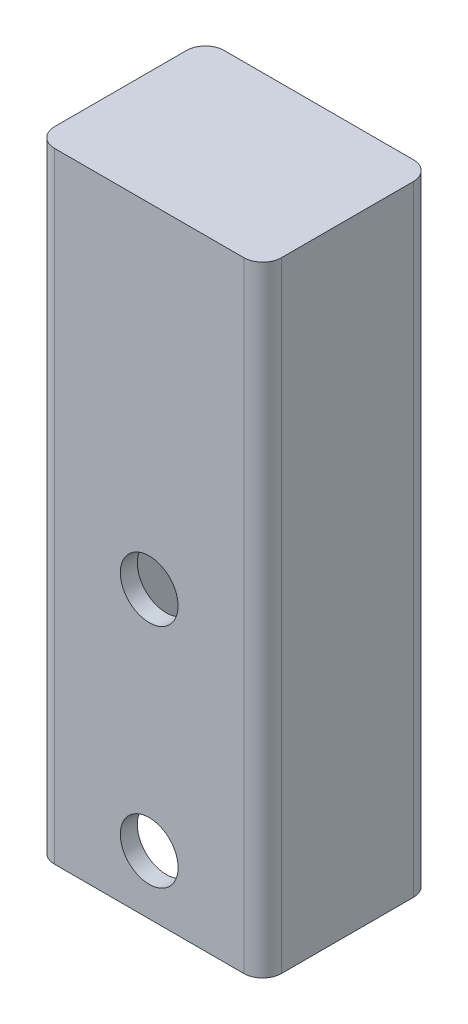
ISO-10303-21;
HEADER;
FILE_DESCRIPTION(('STEP AP214'),'2;1');
FILE_NAME('part.step','',(''),(''),'','','');
FILE_SCHEMA(('AUTOMOTIVE_DESIGN { 1 0 10303 214 1 1 1 1 }'));
ENDSEC;
DATA;
#1=APPLICATION_CONTEXT('core data for automotive mechanical design processes');
#2=APPLICATION_PROTOCOL_DEFINITION('international standard','automotive_design',2000,#1);
#3=PRODUCT_CONTEXT('',#1,'mechanical');
#4=PRODUCT('Part','Part','',(#3));
#5=PRODUCT_RELATED_PRODUCT_CATEGORY('part','',(#4));
#6=PRODUCT_DEFINITION_FORMATION('','',#4);
#7=PRODUCT_DEFINITION_CONTEXT('part definition',#1,'design');
#8=PRODUCT_DEFINITION('design','',#6,#7);
#9=PRODUCT_DEFINITION_SHAPE('','',#8);
#10=(LENGTH_UNIT() NAMED_UNIT(*) SI_UNIT(.MILLI.,.METRE.));
#11=(NAMED_UNIT(*) PLANE_ANGLE_UNIT() SI_UNIT($,.RADIAN.));
#12=(NAMED_UNIT(*) SI_UNIT($,.STERADIAN.) SOLID_ANGLE_UNIT());
#13=UNCERTAINTY_MEASURE_WITH_UNIT(LENGTH_MEASURE(1.E-05),#10,'distance_accuracy_value','');
#14=(GEOMETRIC_REPRESENTATION_CONTEXT(3) GLOBAL_UNCERTAINTY_ASSIGNED_CONTEXT((#13)) GLOBAL_UNIT_ASSIGNED_CONTEXT((#10,
#11,#12)) REPRESENTATION_CONTEXT('',''));
#15=CARTESIAN_POINT('',(0.,0.,0.));
#16=DIRECTION('',(0.,0.,1.));
#17=DIRECTION('',(1.,0.,0.));
#18=AXIS2_PLACEMENT_3D('',#15,#16,#17);
#19=CARTESIAN_POINT('',(16.6979999999778,-85.0268872608011,11.6380000000366));
#20=DIRECTION('',(0.,1.,0.));
#21=DIRECTION('',(-1.,0.,0.));
#22=AXIS2_PLACEMENT_3D('',#19,#20,#21);
#23=CYLINDRICAL_SURFACE('',#22,3.32639999999996);
#24=DIRECTION('',(0.,1.,0.));
#25=VECTOR('',#24,1.);
#26=CARTESIAN_POINT('',(20.0243999999777,-85.0268872608011,11.6380000000366));
#27=LINE('',#26,#25);
#28=CARTESIAN_POINT('',(20.0243999999777,-85.0268872608011,11.6380000000366));
#29=VERTEX_POINT('',#28);
#30=CARTESIAN_POINT('',(20.0243999999767,24.3811127391959,11.6380000000366));
#31=VERTEX_POINT('',#30);
#32=EDGE_CURVE('E264',#29,#31,#27,.T.);
#33=ORIENTED_EDGE('',*,*,#32,.T.);
#34=CARTESIAN_POINT('',(16.6979999999768,24.381112739196,11.6380000000366));
#35=DIRECTION('',(0.,1.,2.47524059519471E-13));
#36=DIRECTION('',(0.,-2.47524059519471E-13,1.));
#37=AXIS2_PLACEMENT_3D('',#34,#35,#36);
#38=CIRCLE('',#37,3.32639999999996);
#39=CARTESIAN_POINT('',(16.6979999999772,24.3811127391951,14.9644000000365));
#40=VERTEX_POINT('',#39);
#41=EDGE_CURVE('E215',#31,#40,#38,.F.);
#42=ORIENTED_EDGE('',*,*,#41,.T.);
#43=DIRECTION('',(0.,1.,0.));
#44=VECTOR('',#43,1.);
#45=CARTESIAN_POINT('',(16.6979999999778,-85.0268872608011,14.9644000000365));
#46=LINE('',#45,#44);
#47=CARTESIAN_POINT('',(16.6979999999778,-85.0268872608011,14.9644000000365));
#48=VERTEX_POINT('',#47);
#49=EDGE_CURVE('E11',#48,#40,#46,.T.);
#50=ORIENTED_EDGE('',*,*,#49,.F.);
#51=CARTESIAN_POINT('',(16.6979999999778,-85.0268872608011,11.6380000000366));
#52=DIRECTION('',(0.,-1.,0.));
#53=DIRECTION('',(1.,0.,0.));
#54=AXIS2_PLACEMENT_3D('',#51,#52,#53);
#55=CIRCLE('',#54,3.32639999999996);
#56=EDGE_CURVE('E218',#29,#48,#55,.T.);
#57=ORIENTED_EDGE('',*,*,#56,.F.);
#58=EDGE_LOOP('',(#33,#42,#50,#57));
#59=FACE_BOUND('',#58,.T.);
#60=ADVANCED_FACE('F38',(#59),#23,.T.);
#61=CARTESIAN_POINT('',(16.6979999999778,-85.0268872608011,14.9644000000365));
#62=DIRECTION('',(0.,0.,-1.));
#63=DIRECTION('',(-1.,0.,0.));
#64=AXIS2_PLACEMENT_3D('',#61,#62,#63);
#65=PLANE('',#64);
#66=CARTESIAN_POINT('',(0.,-34.6469992698592,14.9644000000366));
#67=DIRECTION('',(0.,0.,1.));
#68=DIRECTION('',(1.,0.,0.));
#69=AXIS2_PLACEMENT_3D('',#66,#67,#68);
#70=CIRCLE('',#69,5.1);
#71=CARTESIAN_POINT('',(5.10000000000004,-34.6469992698592,14.9644000000366));
#72=VERTEX_POINT('',#71);
#73=EDGE_CURVE('E292',#72,#72,#70,.T.);
#74=ORIENTED_EDGE('',*,*,#73,.F.);
#75=EDGE_LOOP('',(#74));
#76=FACE_BOUND('',#75,.T.);
#77=CARTESIAN_POINT('',(0.,-74.6469992698592,14.9644000000366));
#78=DIRECTION('',(0.,0.,1.));
#79=DIRECTION('',(-1.,0.,0.));
#80=AXIS2_PLACEMENT_3D('',#77,#78,#79);
#81=CIRCLE('',#80,5.1);
#82=CARTESIAN_POINT('',(-5.09999999999995,-74.6469992698592,14.9644000000366));
#83=VERTEX_POINT('',#82);
#84=EDGE_CURVE('E288',#83,#83,#81,.T.);
#85=ORIENTED_EDGE('',*,*,#84,.F.);
#86=EDGE_LOOP('',(#85));
#87=FACE_BOUND('',#86,.T.);
#88=ORIENTED_EDGE('',*,*,#49,.T.);
#89=DIRECTION('',(-1.,0.,0.));
#90=VECTOR('',#89,1.);
#91=CARTESIAN_POINT('',(16.6979999999761,24.3811127391951,14.9644000000365));
#92=LINE('',#91,#90);
#93=CARTESIAN_POINT('',(-16.6980000000233,24.3811127391952,14.9644000000366));
#94=VERTEX_POINT('',#93);
#95=EDGE_CURVE('E210',#40,#94,#92,.T.);
#96=ORIENTED_EDGE('',*,*,#95,.T.);
#97=DIRECTION('',(0.,1.,0.));
#98=VECTOR('',#97,1.);
#99=CARTESIAN_POINT('',(-16.6980000000223,-85.0268872608014,14.9644000000366));
#100=LINE('',#99,#98);
#101=CARTESIAN_POINT('',(-16.6980000000223,-85.0268872608014,14.9644000000366));
#102=VERTEX_POINT('',#101);
#103=EDGE_CURVE('E48',#102,#94,#100,.T.);
#104=ORIENTED_EDGE('',*,*,#103,.F.);
#105=DIRECTION('',(-1.,0.,0.));
#106=VECTOR('',#105,1.);
#107=CARTESIAN_POINT('',(16.6979999999778,-85.0268872608011,14.9644000000365));
#108=LINE('',#107,#106);
#109=EDGE_CURVE('E244',#48,#102,#108,.T.);
#110=ORIENTED_EDGE('',*,*,#109,.F.);
#111=EDGE_LOOP('',(#88,#96,#104,#110));
#112=FACE_BOUND('',#111,.T.);
#113=ADVANCED_FACE('F387',(#76,#87,#112),#65,.F.);
#114=CARTESIAN_POINT('',(-16.6980000000223,-85.0268872608014,11.6380000000367));
#115=DIRECTION('',(0.,1.,0.));
#116=DIRECTION('',(-1.,0.,0.));
#117=AXIS2_PLACEMENT_3D('',#114,#115,#116);
#118=CYLINDRICAL_SURFACE('',#117,3.32639999999994);
#119=ORIENTED_EDGE('',*,*,#103,.T.);
#120=CARTESIAN_POINT('',(-16.6980000000233,24.3811127391961,11.6380000000367));
#121=DIRECTION('',(0.,1.,2.47524059519471E-13));
#122=DIRECTION('',(0.,-2.47524059519471E-13,1.));
#123=AXIS2_PLACEMENT_3D('',#120,#121,#122);
#124=CIRCLE('',#123,3.32639999999994);
#125=CARTESIAN_POINT('',(-20.0244000000232,24.3811127391961,11.6380000000369));
#126=VERTEX_POINT('',#125);
#127=EDGE_CURVE('E214',#94,#126,#124,.F.);
#128=ORIENTED_EDGE('',*,*,#127,.T.);
#129=DIRECTION('',(0.,1.,0.));
#130=VECTOR('',#129,1.);
#131=CARTESIAN_POINT('',(-20.0244000000222,-85.0268872608014,11.6380000000369));
#132=LINE('',#131,#130);
#133=CARTESIAN_POINT('',(-20.0244000000222,-85.0268872608014,11.6380000000369));
#134=VERTEX_POINT('',#133);
#135=EDGE_CURVE('E279',#134,#126,#132,.T.);
#136=ORIENTED_EDGE('',*,*,#135,.F.);
#137=CARTESIAN_POINT('',(-16.6980000000223,-85.0268872608014,11.6380000000367));
#138=DIRECTION('',(0.,-1.,0.));
#139=DIRECTION('',(1.,0.,0.));
#140=AXIS2_PLACEMENT_3D('',#137,#138,#139);
#141=CIRCLE('',#140,3.32639999999994);
#142=EDGE_CURVE('E247',#102,#134,#141,.T.);
#143=ORIENTED_EDGE('',*,*,#142,.F.);
#144=EDGE_LOOP('',(#119,#128,#136,#143));
#145=FACE_BOUND('',#144,.T.);
#146=ADVANCED_FACE('F393',(#145),#118,.T.);
#147=CARTESIAN_POINT('',(-20.0244000000222,-85.0268872608014,11.6380000000369));
#148=DIRECTION('',(1.,0.,0.));
#149=DIRECTION('',(0.,1.,0.));
#150=AXIS2_PLACEMENT_3D('',#147,#148,#149);
#151=PLANE('',#150);
#152=ORIENTED_EDGE('',*,*,#135,.T.);
#153=DIRECTION('',(0.,2.47524059519471E-13,-1.));
#154=VECTOR('',#153,1.);
#155=CARTESIAN_POINT('',(-20.0244000000232,24.3811127391961,11.6380000000246));
#156=LINE('',#155,#154);
#157=CARTESIAN_POINT('',(-20.0244000000232,24.3811127392019,-11.6379999999634));
#158=VERTEX_POINT('',#157);
#159=EDGE_CURVE('E235',#126,#158,#156,.T.);
#160=ORIENTED_EDGE('',*,*,#159,.T.);
#161=DIRECTION('',(0.,1.,0.));
#162=VECTOR('',#161,1.);
#163=CARTESIAN_POINT('',(-20.0244000000223,-85.0268872608014,-11.6379999999634));
#164=LINE('',#163,#162);
#165=CARTESIAN_POINT('',(-20.0244000000223,-85.0268872608014,-11.6379999999634));
#166=VERTEX_POINT('',#165);
#167=EDGE_CURVE('E276',#166,#158,#164,.T.);
#168=ORIENTED_EDGE('',*,*,#167,.F.);
#169=DIRECTION('',(0.,0.,-1.));
#170=VECTOR('',#169,1.);
#171=CARTESIAN_POINT('',(-20.0244000000222,-85.0268872608014,11.6380000000369));
#172=LINE('',#171,#170);
#173=EDGE_CURVE('E250',#134,#166,#172,.T.);
#174=ORIENTED_EDGE('',*,*,#173,.F.);
#175=EDGE_LOOP('',(#152,#160,#168,#174));
#176=FACE_BOUND('',#175,.T.);
#177=ADVANCED_FACE('F440',(#176),#151,.F.);
#178=CARTESIAN_POINT('',(-16.6980000000223,-85.0268872608014,-11.6379999999634));
#179=DIRECTION('',(0.,1.,0.));
#180=DIRECTION('',(-1.,0.,0.));
#181=AXIS2_PLACEMENT_3D('',#178,#179,#180);
#182=CYLINDRICAL_SURFACE('',#181,3.32639999999996);
#183=ORIENTED_EDGE('',*,*,#167,.T.);
#184=CARTESIAN_POINT('',(-16.6980000000233,24.3811127392018,-11.6379999999634));
#185=DIRECTION('',(0.,1.,2.47524059519471E-13));
#186=DIRECTION('',(0.,-2.47524059519471E-13,1.));
#187=AXIS2_PLACEMENT_3D('',#184,#185,#186);
#188=CIRCLE('',#187,3.32639999999996);
#189=CARTESIAN_POINT('',(-16.6980000000233,24.3811127392027,-14.9643999999633));
#190=VERTEX_POINT('',#189);
#191=EDGE_CURVE('E231',#158,#190,#188,.F.);
#192=ORIENTED_EDGE('',*,*,#191,.T.);
#193=DIRECTION('',(0.,1.,0.));
#194=VECTOR('',#193,1.);
#195=CARTESIAN_POINT('',(-16.6980000000223,-85.0268872608014,-14.9643999999633));
#196=LINE('',#195,#194);
#197=CARTESIAN_POINT('',(-16.6980000000223,-85.0268872608014,-14.9643999999633));
#198=VERTEX_POINT('',#197);
#199=EDGE_CURVE('E273',#198,#190,#196,.T.);
#200=ORIENTED_EDGE('',*,*,#199,.F.);
#201=CARTESIAN_POINT('',(-16.6980000000223,-85.0268872608014,-11.6379999999634));
#202=DIRECTION('',(0.,-1.,0.));
#203=DIRECTION('',(1.,0.,0.));
#204=AXIS2_PLACEMENT_3D('',#201,#202,#203);
#205=CIRCLE('',#204,3.32639999999996);
#206=EDGE_CURVE('E253',#166,#198,#205,.T.);
#207=ORIENTED_EDGE('',*,*,#206,.F.);
#208=EDGE_LOOP('',(#183,#192,#200,#207));
#209=FACE_BOUND('',#208,.T.);
#210=ADVANCED_FACE('F419',(#209),#182,.T.);
#211=CARTESIAN_POINT('',(-16.6980000000223,-85.0268872608014,-14.9643999999633));
#212=DIRECTION('',(0.,0.,1.));
#213=DIRECTION('',(1.,0.,0.));
#214=AXIS2_PLACEMENT_3D('',#211,#212,#213);
#215=PLANE('',#214);
#216=CARTESIAN_POINT('',(0.,-34.6469992698592,-14.9643999999634));
#217=DIRECTION('',(0.,0.,1.));
#218=DIRECTION('',(1.,0.,0.));
#219=AXIS2_PLACEMENT_3D('',#216,#217,#218);
#220=CIRCLE('',#219,5.1);
#221=CARTESIAN_POINT('',(5.10000000000004,-34.6469992698592,-14.9643999999634));
#222=VERTEX_POINT('',#221);
#223=EDGE_CURVE('E297',#222,#222,#220,.T.);
#224=ORIENTED_EDGE('',*,*,#223,.T.);
#225=EDGE_LOOP('',(#224));
#226=FACE_BOUND('',#225,.T.);
#227=CARTESIAN_POINT('',(0.,-74.6469992698592,-14.9643999999634));
#228=DIRECTION('',(0.,0.,1.));
#229=DIRECTION('',(1.,0.,0.));
#230=AXIS2_PLACEMENT_3D('',#227,#228,#229);
#231=CIRCLE('',#230,5.1);
#232=CARTESIAN_POINT('',(5.10000000000004,-74.6469992698592,-14.9643999999634));
#233=VERTEX_POINT('',#232);
#234=EDGE_CURVE('E42',#233,#233,#231,.T.);
#235=ORIENTED_EDGE('',*,*,#234,.T.);
#236=EDGE_LOOP('',(#235));
#237=FACE_BOUND('',#236,.T.);
#238=ORIENTED_EDGE('',*,*,#199,.T.);
#239=DIRECTION('',(1.,0.,0.));
#240=VECTOR('',#239,1.);
#241=CARTESIAN_POINT('',(-16.698000000024,24.3811127392027,-14.9643999999633));
#242=LINE('',#241,#240);
#243=CARTESIAN_POINT('',(16.6979999999772,24.3811127392025,-14.9643999999635));
#244=VERTEX_POINT('',#243);
#245=EDGE_CURVE('E227',#190,#244,#242,.T.);
#246=ORIENTED_EDGE('',*,*,#245,.T.);
#247=DIRECTION('',(0.,1.,0.));
#248=VECTOR('',#247,1.);
#249=CARTESIAN_POINT('',(16.6979999999778,-85.0268872608011,-14.9643999999635));
#250=LINE('',#249,#248);
#251=CARTESIAN_POINT('',(16.6979999999778,-85.0268872608011,-14.9643999999635));
#252=VERTEX_POINT('',#251);
#253=EDGE_CURVE('E270',#252,#244,#250,.T.);
#254=ORIENTED_EDGE('',*,*,#253,.F.);
#255=DIRECTION('',(1.,0.,0.));
#256=VECTOR('',#255,1.);
#257=CARTESIAN_POINT('',(-16.6980000000223,-85.0268872608014,-14.9643999999633));
#258=LINE('',#257,#256);
#259=EDGE_CURVE('E256',#198,#252,#258,.T.);
#260=ORIENTED_EDGE('',*,*,#259,.F.);
#261=EDGE_LOOP('',(#238,#246,#254,#260));
#262=FACE_BOUND('',#261,.T.);
#263=ADVANCED_FACE('F415',(#226,#237,#262),#215,.F.);
#264=CARTESIAN_POINT('',(16.6979999999778,-85.0268872608011,-11.6379999999635));
#265=DIRECTION('',(0.,1.,0.));
#266=DIRECTION('',(-1.,0.,0.));
#267=AXIS2_PLACEMENT_3D('',#264,#265,#266);
#268=CYLINDRICAL_SURFACE('',#267,3.3264);
#269=ORIENTED_EDGE('',*,*,#253,.T.);
#270=CARTESIAN_POINT('',(16.6979999999768,24.3811127392017,-11.6379999999635));
#271=DIRECTION('',(0.,1.,2.47524059519471E-13));
#272=DIRECTION('',(0.,-2.47524059519471E-13,1.));
#273=AXIS2_PLACEMENT_3D('',#270,#271,#272);
#274=CIRCLE('',#273,3.3264);
#275=CARTESIAN_POINT('',(20.0243999999768,24.3811127392017,-11.6379999999635));
#276=VERTEX_POINT('',#275);
#277=EDGE_CURVE('E223',#244,#276,#274,.F.);
#278=ORIENTED_EDGE('',*,*,#277,.T.);
#279=DIRECTION('',(0.,1.,0.));
#280=VECTOR('',#279,1.);
#281=CARTESIAN_POINT('',(20.0243999999778,-85.0268872608011,-11.6379999999635));
#282=LINE('',#281,#280);
#283=CARTESIAN_POINT('',(20.0243999999778,-85.0268872608011,-11.6379999999635));
#284=VERTEX_POINT('',#283);
#285=EDGE_CURVE('E267',#284,#276,#282,.T.);
#286=ORIENTED_EDGE('',*,*,#285,.F.);
#287=CARTESIAN_POINT('',(16.6979999999778,-85.0268872608011,-11.6379999999635));
#288=DIRECTION('',(0.,-1.,0.));
#289=DIRECTION('',(1.,0.,0.));
#290=AXIS2_PLACEMENT_3D('',#287,#288,#289);
#291=CIRCLE('',#290,3.3264);
#292=EDGE_CURVE('E259',#252,#284,#291,.T.);
#293=ORIENTED_EDGE('',*,*,#292,.F.);
#294=EDGE_LOOP('',(#269,#278,#286,#293));
#295=FACE_BOUND('',#294,.T.);
#296=ADVANCED_FACE('F418',(#295),#268,.T.);
#297=CARTESIAN_POINT('',(20.0243999999778,-85.0268872608011,-11.6379999999635));
#298=DIRECTION('',(-1.,0.,0.));
#299=DIRECTION('',(0.,-1.,0.));
#300=AXIS2_PLACEMENT_3D('',#297,#298,#299);
#301=PLANE('',#300);
#302=ORIENTED_EDGE('',*,*,#285,.T.);
#303=DIRECTION('',(0.,-2.47524059519471E-13,1.));
#304=VECTOR('',#303,1.);
#305=CARTESIAN_POINT('',(20.0243999999768,24.3811127392017,-11.6379999999759));
#306=LINE('',#305,#304);
#307=EDGE_CURVE('E219',#276,#31,#306,.T.);
#308=ORIENTED_EDGE('',*,*,#307,.T.);
#309=ORIENTED_EDGE('',*,*,#32,.F.);
#310=DIRECTION('',(0.,0.,1.));
#311=VECTOR('',#310,1.);
#312=CARTESIAN_POINT('',(20.0243999999778,-85.0268872608011,-11.6379999999635));
#313=LINE('',#312,#311);
#314=EDGE_CURVE('E64',#284,#29,#313,.T.);
#315=ORIENTED_EDGE('',*,*,#314,.F.);
#316=EDGE_LOOP('',(#302,#308,#309,#315));
#317=FACE_BOUND('',#316,.T.);
#318=ADVANCED_FACE('F451',(#317),#301,.F.);
#319=CARTESIAN_POINT('',(16.6979999999778,-85.0268872608011,11.6380000000366));
#320=DIRECTION('',(0.,-1.,0.));
#321=DIRECTION('',(1.,0.,0.));
#322=AXIS2_PLACEMENT_3D('',#319,#320,#321);
#323=PLANE('',#322);
#324=CARTESIAN_POINT('',(16.6979999999778,-85.0268872608011,11.6380000000366));
#325=DIRECTION('',(0.,-1.,0.));
#326=DIRECTION('',(1.,0.,0.));
#327=AXIS2_PLACEMENT_3D('',#324,#325,#326);
#328=CIRCLE('',#327,0.326399999999965);
#329=CARTESIAN_POINT('',(17.0243999999777,-85.0268872608011,11.6380000000366));
#330=VERTEX_POINT('',#329);
#331=CARTESIAN_POINT('',(16.6979999999778,-85.0268872608011,11.9644000000365));
#332=VERTEX_POINT('',#331);
#333=EDGE_CURVE('E173',#330,#332,#328,.T.);
#334=ORIENTED_EDGE('',*,*,#333,.F.);
#335=DIRECTION('',(0.,0.,1.));
#336=VECTOR('',#335,1.);
#337=CARTESIAN_POINT('',(17.0243999999778,-85.0268872608011,-11.6379999999635));
#338=LINE('',#337,#336);
#339=CARTESIAN_POINT('',(17.0243999999778,-85.0268872608011,-11.6379999999635));
#340=VERTEX_POINT('',#339);
#341=EDGE_CURVE('E159',#340,#330,#338,.T.);
#342=ORIENTED_EDGE('',*,*,#341,.F.);
#343=CARTESIAN_POINT('',(16.6979999999778,-85.0268872608011,-11.6379999999635));
#344=DIRECTION('',(0.,-1.,0.));
#345=DIRECTION('',(1.,0.,0.));
#346=AXIS2_PLACEMENT_3D('',#343,#344,#345);
#347=CIRCLE('',#346,0.326400000000004);
#348=CARTESIAN_POINT('',(16.6979999999778,-85.0268872608011,-11.9643999999635));
#349=VERTEX_POINT('',#348);
#350=EDGE_CURVE('E205',#349,#340,#347,.T.);
#351=ORIENTED_EDGE('',*,*,#350,.F.);
#352=DIRECTION('',(1.,0.,0.));
#353=VECTOR('',#352,1.);
#354=CARTESIAN_POINT('',(-16.6980000000223,-85.0268872608014,-11.9643999999633));
#355=LINE('',#354,#353);
#356=CARTESIAN_POINT('',(-16.6980000000223,-85.0268872608014,-11.9643999999633));
#357=VERTEX_POINT('',#356);
#358=EDGE_CURVE('E202',#357,#349,#355,.T.);
#359=ORIENTED_EDGE('',*,*,#358,.F.);
#360=CARTESIAN_POINT('',(-16.6980000000223,-85.0268872608014,-11.6379999999634));
#361=DIRECTION('',(0.,-1.,0.));
#362=DIRECTION('',(1.,0.,0.));
#363=AXIS2_PLACEMENT_3D('',#360,#361,#362);
#364=CIRCLE('',#363,0.326399999999956);
#365=CARTESIAN_POINT('',(-17.0244000000223,-85.0268872608014,-11.6379999999634));
#366=VERTEX_POINT('',#365);
#367=EDGE_CURVE('E199',#366,#357,#364,.T.);
#368=ORIENTED_EDGE('',*,*,#367,.F.);
#369=DIRECTION('',(0.,0.,-1.));
#370=VECTOR('',#369,1.);
#371=CARTESIAN_POINT('',(-17.0244000000222,-85.0268872608014,11.6380000000369));
#372=LINE('',#371,#370);
#373=CARTESIAN_POINT('',(-17.0244000000222,-85.0268872608014,11.6380000000367));
#374=VERTEX_POINT('',#373);
#375=EDGE_CURVE('E196',#374,#366,#372,.T.);
#376=ORIENTED_EDGE('',*,*,#375,.F.);
#377=CARTESIAN_POINT('',(-16.6980000000223,-85.0268872608014,11.6380000000367));
#378=DIRECTION('',(0.,-1.,0.));
#379=DIRECTION('',(1.,0.,0.));
#380=AXIS2_PLACEMENT_3D('',#377,#378,#379);
#381=CIRCLE('',#380,0.326399999999942);
#382=CARTESIAN_POINT('',(-16.6980000000223,-85.0268872608014,11.9644000000366));
#383=VERTEX_POINT('',#382);
#384=EDGE_CURVE('E193',#383,#374,#381,.T.);
#385=ORIENTED_EDGE('',*,*,#384,.F.);
#386=DIRECTION('',(-1.,0.,0.));
#387=VECTOR('',#386,1.);
#388=CARTESIAN_POINT('',(16.6979999999778,-85.0268872608011,11.9644000000365));
#389=LINE('',#388,#387);
#390=EDGE_CURVE('E190',#332,#383,#389,.T.);
#391=ORIENTED_EDGE('',*,*,#390,.F.);
#392=EDGE_LOOP('',(#334,#342,#351,#359,#368,#376,#385,#391));
#393=FACE_BOUND('',#392,.T.);
#394=ORIENTED_EDGE('',*,*,#56,.T.);
#395=ORIENTED_EDGE('',*,*,#109,.T.);
#396=ORIENTED_EDGE('',*,*,#142,.T.);
#397=ORIENTED_EDGE('',*,*,#173,.T.);
#398=ORIENTED_EDGE('',*,*,#206,.T.);
#399=ORIENTED_EDGE('',*,*,#259,.T.);
#400=ORIENTED_EDGE('',*,*,#292,.T.);
#401=ORIENTED_EDGE('',*,*,#314,.T.);
#402=EDGE_LOOP('',(#394,#395,#396,#397,#398,#399,#400,#401));
#403=FACE_BOUND('',#402,.T.);
#404=ADVANCED_FACE('F337',(#393,#403),#323,.T.);
#405=CARTESIAN_POINT('',(-16.6980000000236,24.3811127392018,-11.6379999999712));
#406=DIRECTION('',(0.,1.,2.47524059519471E-13));
#407=DIRECTION('',(0.,-2.47524059519471E-13,1.));
#408=AXIS2_PLACEMENT_3D('',#405,#406,#407);
#409=PLANE('',#408);
#410=ORIENTED_EDGE('',*,*,#41,.F.);
#411=ORIENTED_EDGE('',*,*,#307,.F.);
#412=ORIENTED_EDGE('',*,*,#277,.F.);
#413=ORIENTED_EDGE('',*,*,#245,.F.);
#414=ORIENTED_EDGE('',*,*,#191,.F.);
#415=ORIENTED_EDGE('',*,*,#159,.F.);
#416=ORIENTED_EDGE('',*,*,#127,.F.);
#417=ORIENTED_EDGE('',*,*,#95,.F.);
#418=EDGE_LOOP('',(#410,#411,#412,#413,#414,#415,#416,#417));
#419=FACE_BOUND('',#418,.T.);
#420=ADVANCED_FACE('F434',(#419),#409,.T.);
#421=CARTESIAN_POINT('',(16.6979999999778,-85.0268872608011,11.6380000000366));
#422=DIRECTION('',(0.,1.,0.));
#423=DIRECTION('',(-1.,0.,0.));
#424=AXIS2_PLACEMENT_3D('',#421,#422,#423);
#425=CYLINDRICAL_SURFACE('',#424,0.326399999999965);
#426=DIRECTION('',(0.,1.,0.));
#427=VECTOR('',#426,1.);
#428=CARTESIAN_POINT('',(17.0243999999778,-85.0268872608011,11.6380000000366));
#429=LINE('',#428,#427);
#430=CARTESIAN_POINT('',(17.0243999999768,21.3811127391959,11.6380000000366));
#431=VERTEX_POINT('',#430);
#432=EDGE_CURVE('E152',#330,#431,#429,.T.);
#433=ORIENTED_EDGE('',*,*,#432,.F.);
#434=ORIENTED_EDGE('',*,*,#333,.T.);
#435=DIRECTION('',(0.,1.,0.));
#436=VECTOR('',#435,1.);
#437=CARTESIAN_POINT('',(16.6979999999778,-85.0268872608011,11.9644000000365));
#438=LINE('',#437,#436);
#439=CARTESIAN_POINT('',(16.6979999999778,21.3811127391959,11.9644000000365));
#440=VERTEX_POINT('',#439);
#441=EDGE_CURVE('E168',#332,#440,#438,.T.);
#442=ORIENTED_EDGE('',*,*,#441,.T.);
#443=CARTESIAN_POINT('',(16.6979999999768,21.3811127391959,11.6380000000366));
#444=DIRECTION('',(0.,1.,2.47524059519471E-13));
#445=DIRECTION('',(0.,-2.47524059519471E-13,1.));
#446=AXIS2_PLACEMENT_3D('',#443,#444,#445);
#447=CIRCLE('',#446,0.326399999999965);
#448=EDGE_CURVE('E165',#431,#440,#447,.F.);
#449=ORIENTED_EDGE('',*,*,#448,.F.);
#450=EDGE_LOOP('',(#433,#434,#442,#449));
#451=FACE_BOUND('',#450,.T.);
#452=ADVANCED_FACE('F166',(#451),#425,.F.);
#453=CARTESIAN_POINT('',(16.6979999999778,-85.0268872608011,11.9644000000365));
#454=DIRECTION('',(0.,0.,-1.));
#455=DIRECTION('',(-1.,0.,0.));
#456=AXIS2_PLACEMENT_3D('',#453,#454,#455);
#457=PLANE('',#456);
#458=CARTESIAN_POINT('',(0.,-34.6469992698592,11.9644000000366));
#459=DIRECTION('',(0.,0.,-1.));
#460=DIRECTION('',(-1.,0.,0.));
#461=AXIS2_PLACEMENT_3D('',#458,#459,#460);
#462=CIRCLE('',#461,5.1);
#463=CARTESIAN_POINT('',(-5.09999999999996,-34.6469992698592,11.9644000000366));
#464=VERTEX_POINT('',#463);
#465=EDGE_CURVE('E293',#464,#464,#462,.T.);
#466=ORIENTED_EDGE('',*,*,#465,.F.);
#467=EDGE_LOOP('',(#466));
#468=FACE_BOUND('',#467,.T.);
#469=CARTESIAN_POINT('',(0.,-74.6469992698592,11.9644000000366));
#470=DIRECTION('',(0.,0.,-1.));
#471=DIRECTION('',(-1.,0.,0.));
#472=AXIS2_PLACEMENT_3D('',#469,#470,#471);
#473=CIRCLE('',#472,5.1);
#474=CARTESIAN_POINT('',(-5.09999999999995,-74.6469992698592,11.9644000000366));
#475=VERTEX_POINT('',#474);
#476=EDGE_CURVE('E284',#475,#475,#473,.T.);
#477=ORIENTED_EDGE('',*,*,#476,.F.);
#478=EDGE_LOOP('',(#477));
#479=FACE_BOUND('',#478,.T.);
#480=ORIENTED_EDGE('',*,*,#441,.F.);
#481=ORIENTED_EDGE('',*,*,#390,.T.);
#482=DIRECTION('',(0.,1.,0.));
#483=VECTOR('',#482,1.);
#484=CARTESIAN_POINT('',(-16.6980000000223,-85.0268872608014,11.9644000000366));
#485=LINE('',#484,#483);
#486=CARTESIAN_POINT('',(-16.6980000000233,21.381112739196,11.9644000000366));
#487=VERTEX_POINT('',#486);
#488=EDGE_CURVE('E358',#383,#487,#485,.T.);
#489=ORIENTED_EDGE('',*,*,#488,.T.);
#490=DIRECTION('',(-1.,0.,0.));
#491=VECTOR('',#490,1.);
#492=CARTESIAN_POINT('',(-16.6980000000235,21.381112739196,11.9644000000366));
#493=LINE('',#492,#491);
#494=EDGE_CURVE('E307',#440,#487,#493,.T.);
#495=ORIENTED_EDGE('',*,*,#494,.F.);
#496=EDGE_LOOP('',(#480,#481,#489,#495));
#497=FACE_BOUND('',#496,.T.);
#498=ADVANCED_FACE('F369',(#468,#479,#497),#457,.T.);
#499=CARTESIAN_POINT('',(-16.6980000000223,-85.0268872608014,11.6380000000367));
#500=DIRECTION('',(0.,1.,0.));
#501=DIRECTION('',(-1.,0.,0.));
#502=AXIS2_PLACEMENT_3D('',#499,#500,#501);
#503=CYLINDRICAL_SURFACE('',#502,0.326399999999942);
#504=ORIENTED_EDGE('',*,*,#488,.F.);
#505=ORIENTED_EDGE('',*,*,#384,.T.);
#506=DIRECTION('',(0.,1.,0.));
#507=VECTOR('',#506,1.);
#508=CARTESIAN_POINT('',(-17.0244000000222,-85.0268872608014,11.6380000000369));
#509=LINE('',#508,#507);
#510=CARTESIAN_POINT('',(-17.0244000000232,21.3811127391961,11.6380000000369));
#511=VERTEX_POINT('',#510);
#512=EDGE_CURVE('E351',#374,#511,#509,.T.);
#513=ORIENTED_EDGE('',*,*,#512,.T.);
#514=CARTESIAN_POINT('',(-16.6980000000233,21.3811127391961,11.6380000000367));
#515=DIRECTION('',(0.,1.,2.47524059519471E-13));
#516=DIRECTION('',(0.,-2.47524059519471E-13,1.));
#517=AXIS2_PLACEMENT_3D('',#514,#515,#516);
#518=CIRCLE('',#517,0.326399999999942);
#519=EDGE_CURVE('E355',#487,#511,#518,.F.);
#520=ORIENTED_EDGE('',*,*,#519,.F.);
#521=EDGE_LOOP('',(#504,#505,#513,#520));
#522=FACE_BOUND('',#521,.T.);
#523=ADVANCED_FACE('F374',(#522),#503,.F.);
#524=CARTESIAN_POINT('',(-17.0244000000222,-85.0268872608014,11.6380000000369));
#525=DIRECTION('',(1.,0.,0.));
#526=DIRECTION('',(0.,1.,0.));
#527=AXIS2_PLACEMENT_3D('',#524,#525,#526);
#528=PLANE('',#527);
#529=ORIENTED_EDGE('',*,*,#512,.F.);
#530=ORIENTED_EDGE('',*,*,#375,.T.);
#531=DIRECTION('',(0.,1.,0.));
#532=VECTOR('',#531,1.);
#533=CARTESIAN_POINT('',(-17.0244000000223,-85.0268872608014,-11.6379999999634));
#534=LINE('',#533,#532);
#535=CARTESIAN_POINT('',(-17.0244000000232,21.3811127392018,-11.6379999999634));
#536=VERTEX_POINT('',#535);
#537=EDGE_CURVE('E331',#366,#536,#534,.T.);
#538=ORIENTED_EDGE('',*,*,#537,.T.);
#539=DIRECTION('',(0.,2.47524059519471E-13,-1.));
#540=VECTOR('',#539,1.);
#541=CARTESIAN_POINT('',(-17.0244000000232,21.3811127392018,-11.6379999999719));
#542=LINE('',#541,#540);
#543=EDGE_CURVE('E348',#511,#536,#542,.T.);
#544=ORIENTED_EDGE('',*,*,#543,.F.);
#545=EDGE_LOOP('',(#529,#530,#538,#544));
#546=FACE_BOUND('',#545,.T.);
#547=ADVANCED_FACE('F378',(#546),#528,.T.);
#548=CARTESIAN_POINT('',(-16.6980000000223,-85.0268872608014,-11.6379999999634));
#549=DIRECTION('',(0.,1.,0.));
#550=DIRECTION('',(-1.,0.,0.));
#551=AXIS2_PLACEMENT_3D('',#548,#549,#550);
#552=CYLINDRICAL_SURFACE('',#551,0.326399999999956);
#553=ORIENTED_EDGE('',*,*,#537,.F.);
#554=ORIENTED_EDGE('',*,*,#367,.T.);
#555=DIRECTION('',(0.,1.,0.));
#556=VECTOR('',#555,1.);
#557=CARTESIAN_POINT('',(-16.6980000000223,-85.0268872608014,-11.9643999999633));
#558=LINE('',#557,#556);
#559=CARTESIAN_POINT('',(-16.6980000000223,21.3811127392019,-11.9643999999633));
#560=VERTEX_POINT('',#559);
#561=EDGE_CURVE('E324',#357,#560,#558,.T.);
#562=ORIENTED_EDGE('',*,*,#561,.T.);
#563=CARTESIAN_POINT('',(-16.6980000000233,21.3811127392018,-11.6379999999634));
#564=DIRECTION('',(0.,1.,2.47524059519471E-13));
#565=DIRECTION('',(0.,-2.47524059519471E-13,1.));
#566=AXIS2_PLACEMENT_3D('',#563,#564,#565);
#567=CIRCLE('',#566,0.326399999999956);
#568=EDGE_CURVE('E344',#536,#560,#567,.F.);
#569=ORIENTED_EDGE('',*,*,#568,.F.);
#570=EDGE_LOOP('',(#553,#554,#562,#569));
#571=FACE_BOUND('',#570,.T.);
#572=ADVANCED_FACE('F319',(#571),#552,.F.);
#573=CARTESIAN_POINT('',(-16.6980000000223,-85.0268872608014,-11.9643999999633));
#574=DIRECTION('',(0.,0.,1.));
#575=DIRECTION('',(1.,0.,0.));
#576=AXIS2_PLACEMENT_3D('',#573,#574,#575);
#577=PLANE('',#576);
#578=CARTESIAN_POINT('',(0.,-34.6469992698592,-11.9643999999634));
#579=DIRECTION('',(0.,0.,1.));
#580=DIRECTION('',(1.,0.,0.));
#581=AXIS2_PLACEMENT_3D('',#578,#579,#580);
#582=CIRCLE('',#581,5.1);
#583=CARTESIAN_POINT('',(5.10000000000004,-34.6469992698592,-11.9643999999634));
#584=VERTEX_POINT('',#583);
#585=EDGE_CURVE('E298',#584,#584,#582,.T.);
#586=ORIENTED_EDGE('',*,*,#585,.F.);
#587=EDGE_LOOP('',(#586));
#588=FACE_BOUND('',#587,.T.);
#589=CARTESIAN_POINT('',(0.,-74.6469992698592,-11.9643999999634));
#590=DIRECTION('',(0.,0.,1.));
#591=DIRECTION('',(1.,0.,0.));
#592=AXIS2_PLACEMENT_3D('',#589,#590,#591);
#593=CIRCLE('',#592,5.1);
#594=CARTESIAN_POINT('',(5.10000000000004,-74.6469992698592,-11.9643999999634));
#595=VERTEX_POINT('',#594);
#596=EDGE_CURVE('E287',#595,#595,#593,.T.);
#597=ORIENTED_EDGE('',*,*,#596,.F.);
#598=EDGE_LOOP('',(#597));
#599=FACE_BOUND('',#598,.T.);
#600=ORIENTED_EDGE('',*,*,#561,.F.);
#601=ORIENTED_EDGE('',*,*,#358,.T.);
#602=DIRECTION('',(0.,1.,0.));
#603=VECTOR('',#602,1.);
#604=CARTESIAN_POINT('',(16.6979999999778,-85.0268872608011,-11.9643999999635));
#605=LINE('',#604,#603);
#606=CARTESIAN_POINT('',(16.6979999999768,21.3811127392018,-11.9643999999635));
#607=VERTEX_POINT('',#606);
#608=EDGE_CURVE('E332',#349,#607,#605,.T.);
#609=ORIENTED_EDGE('',*,*,#608,.T.);
#610=DIRECTION('',(1.,0.,0.));
#611=VECTOR('',#610,1.);
#612=CARTESIAN_POINT('',(-16.6980000000236,21.3811127392019,-11.9643999999633));
#613=LINE('',#612,#611);
#614=EDGE_CURVE('E184',#560,#607,#613,.T.);
#615=ORIENTED_EDGE('',*,*,#614,.F.);
#616=EDGE_LOOP('',(#600,#601,#609,#615));
#617=FACE_BOUND('',#616,.T.);
#618=ADVANCED_FACE('F315',(#588,#599,#617),#577,.T.);
#619=CARTESIAN_POINT('',(16.6979999999778,-85.0268872608011,-11.6379999999635));
#620=DIRECTION('',(0.,1.,0.));
#621=DIRECTION('',(-1.,0.,0.));
#622=AXIS2_PLACEMENT_3D('',#619,#620,#621);
#623=CYLINDRICAL_SURFACE('',#622,0.326400000000004);
#624=ORIENTED_EDGE('',*,*,#608,.F.);
#625=ORIENTED_EDGE('',*,*,#350,.T.);
#626=DIRECTION('',(0.,-1.,0.));
#627=VECTOR('',#626,1.);
#628=CARTESIAN_POINT('',(17.0243999999778,-85.0268872608011,-11.6379999999635));
#629=LINE('',#628,#627);
#630=CARTESIAN_POINT('',(17.0243999999768,21.3811127392017,-11.6379999999635));
#631=VERTEX_POINT('',#630);
#632=EDGE_CURVE('E56',#340,#631,#629,.F.);
#633=ORIENTED_EDGE('',*,*,#632,.T.);
#634=CARTESIAN_POINT('',(16.6979999999768,21.3811127392017,-11.6379999999635));
#635=DIRECTION('',(0.,1.,2.47524059519471E-13));
#636=DIRECTION('',(0.,-2.47524059519471E-13,1.));
#637=AXIS2_PLACEMENT_3D('',#634,#635,#636);
#638=CIRCLE('',#637,0.326400000000004);
#639=EDGE_CURVE('E178',#607,#631,#638,.F.);
#640=ORIENTED_EDGE('',*,*,#639,.F.);
#641=EDGE_LOOP('',(#624,#625,#633,#640));
#642=FACE_BOUND('',#641,.T.);
#643=ADVANCED_FACE('F318',(#642),#623,.F.);
#644=CARTESIAN_POINT('',(17.0243999999778,-85.0268872608011,-11.6379999999635));
#645=DIRECTION('',(-1.,0.,0.));
#646=DIRECTION('',(0.,-1.,0.));
#647=AXIS2_PLACEMENT_3D('',#644,#645,#646);
#648=PLANE('',#647);
#649=ORIENTED_EDGE('',*,*,#632,.F.);
#650=ORIENTED_EDGE('',*,*,#341,.T.);
#651=ORIENTED_EDGE('',*,*,#432,.T.);
#652=DIRECTION('',(0.,-2.47524059519471E-13,1.));
#653=VECTOR('',#652,1.);
#654=CARTESIAN_POINT('',(17.0243999999768,21.3811127392017,-11.6379999999719));
#655=LINE('',#654,#653);
#656=EDGE_CURVE('E156',#631,#431,#655,.T.);
#657=ORIENTED_EDGE('',*,*,#656,.F.);
#658=EDGE_LOOP('',(#649,#650,#651,#657));
#659=FACE_BOUND('',#658,.T.);
#660=ADVANCED_FACE('F154',(#659),#648,.T.);
#661=CARTESIAN_POINT('',(-16.6980000000236,21.3811127392018,-11.6379999999719));
#662=DIRECTION('',(0.,1.,2.47524059519471E-13));
#663=DIRECTION('',(0.,-2.47524059519471E-13,1.));
#664=AXIS2_PLACEMENT_3D('',#661,#662,#663);
#665=PLANE('',#664);
#666=ORIENTED_EDGE('',*,*,#448,.T.);
#667=ORIENTED_EDGE('',*,*,#494,.T.);
#668=ORIENTED_EDGE('',*,*,#519,.T.);
#669=ORIENTED_EDGE('',*,*,#543,.T.);
#670=ORIENTED_EDGE('',*,*,#568,.T.);
#671=ORIENTED_EDGE('',*,*,#614,.T.);
#672=ORIENTED_EDGE('',*,*,#639,.T.);
#673=ORIENTED_EDGE('',*,*,#656,.T.);
#674=EDGE_LOOP('',(#666,#667,#668,#669,#670,#671,#672,#673));
#675=FACE_BOUND('',#674,.T.);
#676=ADVANCED_FACE('F175',(#675),#665,.F.);
#677=CARTESIAN_POINT('',(0.,-74.6469992698592,-63.0355999999634));
#678=DIRECTION('',(0.,0.,1.));
#679=DIRECTION('',(1.,0.,0.));
#680=AXIS2_PLACEMENT_3D('',#677,#678,#679);
#681=CYLINDRICAL_SURFACE('',#680,5.1);
#682=ORIENTED_EDGE('',*,*,#596,.T.);
#683=EDGE_LOOP('',(#682));
#684=FACE_BOUND('',#683,.T.);
#685=ORIENTED_EDGE('',*,*,#234,.F.);
#686=EDGE_LOOP('',(#685));
#687=FACE_BOUND('',#686,.T.);
#688=ADVANCED_FACE('F40',(#684,#687),#681,.F.);
#689=CARTESIAN_POINT('',(0.,-34.6469992698592,-63.0355999999634));
#690=DIRECTION('',(0.,0.,1.));
#691=DIRECTION('',(1.,0.,0.));
#692=AXIS2_PLACEMENT_3D('',#689,#690,#691);
#693=CYLINDRICAL_SURFACE('',#692,5.1);
#694=ORIENTED_EDGE('',*,*,#585,.T.);
#695=EDGE_LOOP('',(#694));
#696=FACE_BOUND('',#695,.T.);
#697=ORIENTED_EDGE('',*,*,#223,.F.);
#698=EDGE_LOOP('',(#697));
#699=FACE_BOUND('',#698,.T.);
#700=ADVANCED_FACE('F402',(#696,#699),#693,.F.);
#701=CARTESIAN_POINT('',(0.,-74.6469992698592,-63.0355999999634));
#702=DIRECTION('',(0.,0.,1.));
#703=DIRECTION('',(1.,0.,0.));
#704=AXIS2_PLACEMENT_3D('',#701,#702,#703);
#705=CYLINDRICAL_SURFACE('',#704,5.1);
#706=ORIENTED_EDGE('',*,*,#476,.T.);
#707=EDGE_LOOP('',(#706));
#708=FACE_BOUND('',#707,.T.);
#709=ORIENTED_EDGE('',*,*,#84,.T.);
#710=EDGE_LOOP('',(#709));
#711=FACE_BOUND('',#710,.T.);
#712=ADVANCED_FACE('F398',(#708,#711),#705,.F.);
#713=CARTESIAN_POINT('',(0.,-34.6469992698592,-63.0355999999634));
#714=DIRECTION('',(0.,0.,1.));
#715=DIRECTION('',(1.,0.,0.));
#716=AXIS2_PLACEMENT_3D('',#713,#714,#715);
#717=CYLINDRICAL_SURFACE('',#716,5.1);
#718=ORIENTED_EDGE('',*,*,#465,.T.);
#719=EDGE_LOOP('',(#718));
#720=FACE_BOUND('',#719,.T.);
#721=ORIENTED_EDGE('',*,*,#73,.T.);
#722=EDGE_LOOP('',(#721));
#723=FACE_BOUND('',#722,.T.);
#724=ADVANCED_FACE('F401',(#720,#723),#717,.F.);
#725=CLOSED_SHELL('',(#60,#113,#146,#177,#210,#263,#296,#318,#404,#420,#452,#498,#523,#547,#572,
#618,#643,#660,#676,#688,#700,#712,#724));
#726=MANIFOLD_SOLID_BREP('B2',#725);
#727=ADVANCED_BREP_SHAPE_REPRESENTATION('',(#18,#726),#14);
#728=SHAPE_DEFINITION_REPRESENTATION(#9,#727);
ENDSEC;
END-ISO-10303-21;
